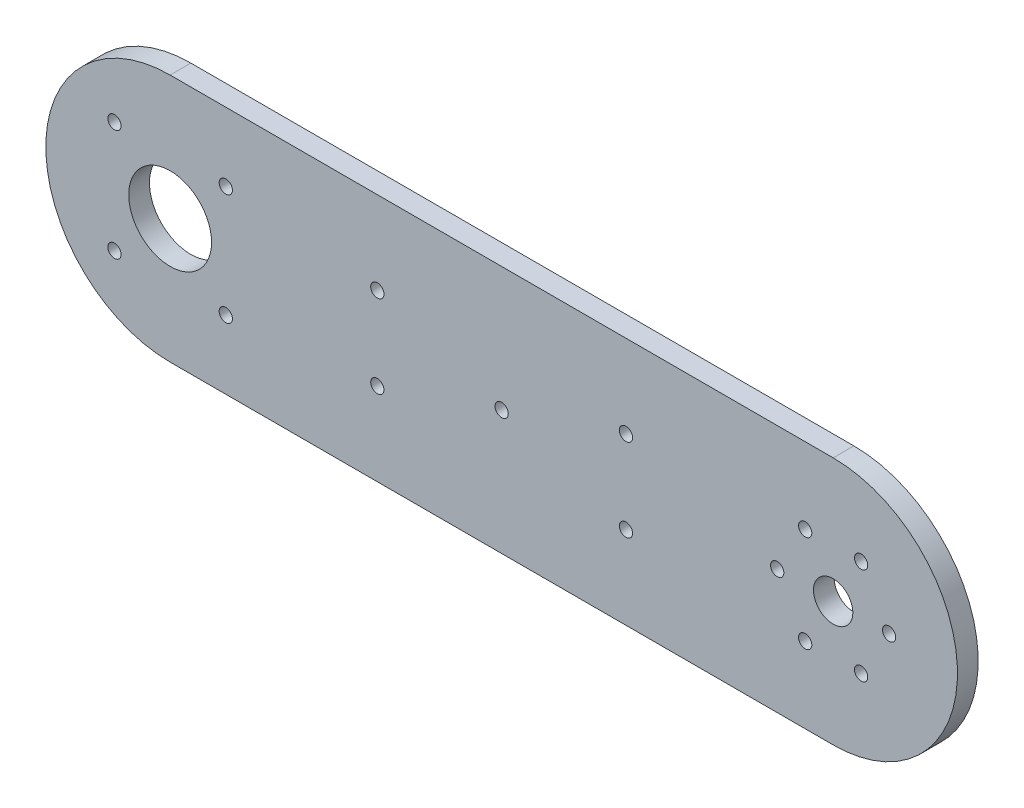
ISO-10303-21;
HEADER;
FILE_DESCRIPTION(('STEP AP214'),'2;1');
FILE_NAME('part.step','',(''),(''),'','','');
FILE_SCHEMA(('AUTOMOTIVE_DESIGN { 1 0 10303 214 1 1 1 1 }'));
ENDSEC;
DATA;
#1=APPLICATION_CONTEXT('core data for automotive mechanical design processes');
#2=APPLICATION_PROTOCOL_DEFINITION('international standard','automotive_design',2000,#1);
#3=PRODUCT_CONTEXT('',#1,'mechanical');
#4=PRODUCT('Part','Part','',(#3));
#5=PRODUCT_RELATED_PRODUCT_CATEGORY('part','',(#4));
#6=PRODUCT_DEFINITION_FORMATION('','',#4);
#7=PRODUCT_DEFINITION_CONTEXT('part definition',#1,'design');
#8=PRODUCT_DEFINITION('design','',#6,#7);
#9=PRODUCT_DEFINITION_SHAPE('','',#8);
#10=(LENGTH_UNIT() NAMED_UNIT(*) SI_UNIT(.MILLI.,.METRE.));
#11=(NAMED_UNIT(*) PLANE_ANGLE_UNIT() SI_UNIT($,.RADIAN.));
#12=(NAMED_UNIT(*) SI_UNIT($,.STERADIAN.) SOLID_ANGLE_UNIT());
#13=UNCERTAINTY_MEASURE_WITH_UNIT(LENGTH_MEASURE(1.E-05),#10,'distance_accuracy_value','');
#14=(GEOMETRIC_REPRESENTATION_CONTEXT(3) GLOBAL_UNCERTAINTY_ASSIGNED_CONTEXT((#13)) GLOBAL_UNIT_ASSIGNED_CONTEXT((#10,
#11,#12)) REPRESENTATION_CONTEXT('',''));
#15=CARTESIAN_POINT('',(0.,0.,0.));
#16=DIRECTION('',(0.,0.,1.));
#17=DIRECTION('',(1.,0.,0.));
#18=AXIS2_PLACEMENT_3D('',#15,#16,#17);
#19=CARTESIAN_POINT('',(80.,0.,5.));
#20=DIRECTION('',(0.,0.,1.));
#21=DIRECTION('',(1.,0.,0.));
#22=AXIS2_PLACEMENT_3D('',#19,#20,#21);
#23=PLANE('',#22);
#24=CARTESIAN_POINT('',(0.,0.,5.));
#25=DIRECTION('',(0.,0.,1.));
#26=DIRECTION('',(1.,0.,0.));
#27=AXIS2_PLACEMENT_3D('',#24,#25,#26);
#28=CIRCLE('',#27,1.60000000000001);
#29=CARTESIAN_POINT('',(1.60000000000001,0.,5.));
#30=VERTEX_POINT('',#29);
#31=EDGE_CURVE('E218',#30,#30,#28,.T.);
#32=ORIENTED_EDGE('',*,*,#31,.F.);
#33=EDGE_LOOP('',(#32));
#34=FACE_BOUND('',#33,.T.);
#35=CARTESIAN_POINT('',(-30.,-10.,5.));
#36=DIRECTION('',(0.,0.,1.));
#37=DIRECTION('',(1.,0.,0.));
#38=AXIS2_PLACEMENT_3D('',#35,#36,#37);
#39=CIRCLE('',#38,1.60000000000001);
#40=CARTESIAN_POINT('',(-28.4,-10.,5.));
#41=VERTEX_POINT('',#40);
#42=EDGE_CURVE('E212',#41,#41,#39,.T.);
#43=ORIENTED_EDGE('',*,*,#42,.F.);
#44=EDGE_LOOP('',(#43));
#45=FACE_BOUND('',#44,.T.);
#46=CARTESIAN_POINT('',(30.,10.,5.));
#47=DIRECTION('',(0.,0.,1.));
#48=DIRECTION('',(1.,0.,0.));
#49=AXIS2_PLACEMENT_3D('',#46,#47,#48);
#50=CIRCLE('',#49,1.60000000000001);
#51=CARTESIAN_POINT('',(31.6,10.,5.));
#52=VERTEX_POINT('',#51);
#53=EDGE_CURVE('E206',#52,#52,#50,.T.);
#54=ORIENTED_EDGE('',*,*,#53,.F.);
#55=EDGE_LOOP('',(#54));
#56=FACE_BOUND('',#55,.T.);
#57=CARTESIAN_POINT('',(30.,-9.99999999999999,5.));
#58=DIRECTION('',(0.,0.,1.));
#59=DIRECTION('',(1.,0.,0.));
#60=AXIS2_PLACEMENT_3D('',#57,#58,#59);
#61=CIRCLE('',#60,1.60000000000001);
#62=CARTESIAN_POINT('',(31.6,-9.99999999999999,5.));
#63=VERTEX_POINT('',#62);
#64=EDGE_CURVE('E200',#63,#63,#61,.T.);
#65=ORIENTED_EDGE('',*,*,#64,.F.);
#66=EDGE_LOOP('',(#65));
#67=FACE_BOUND('',#66,.T.);
#68=CARTESIAN_POINT('',(-30.,10.,5.));
#69=DIRECTION('',(0.,0.,1.));
#70=DIRECTION('',(1.,0.,0.));
#71=AXIS2_PLACEMENT_3D('',#68,#69,#70);
#72=CIRCLE('',#71,1.60000000000001);
#73=CARTESIAN_POINT('',(-28.4,10.,5.));
#74=VERTEX_POINT('',#73);
#75=EDGE_CURVE('E194',#74,#74,#72,.T.);
#76=ORIENTED_EDGE('',*,*,#75,.F.);
#77=EDGE_LOOP('',(#76));
#78=FACE_BOUND('',#77,.T.);
#79=CARTESIAN_POINT('',(-66.5649711574556,13.4350288425444,5.));
#80=DIRECTION('',(0.,0.,1.));
#81=DIRECTION('',(1.,0.,0.));
#82=AXIS2_PLACEMENT_3D('',#79,#80,#81);
#83=CIRCLE('',#82,1.60000000000002);
#84=CARTESIAN_POINT('',(-64.9649711574556,13.4350288425444,5.));
#85=VERTEX_POINT('',#84);
#86=EDGE_CURVE('E188',#85,#85,#83,.T.);
#87=ORIENTED_EDGE('',*,*,#86,.F.);
#88=EDGE_LOOP('',(#87));
#89=FACE_BOUND('',#88,.T.);
#90=CARTESIAN_POINT('',(-93.4350288425444,13.4350288425444,5.));
#91=DIRECTION('',(0.,0.,1.));
#92=DIRECTION('',(1.,0.,0.));
#93=AXIS2_PLACEMENT_3D('',#90,#91,#92);
#94=CIRCLE('',#93,1.60000000000002);
#95=CARTESIAN_POINT('',(-91.8350288425444,13.4350288425444,5.));
#96=VERTEX_POINT('',#95);
#97=EDGE_CURVE('E182',#96,#96,#94,.T.);
#98=ORIENTED_EDGE('',*,*,#97,.F.);
#99=EDGE_LOOP('',(#98));
#100=FACE_BOUND('',#99,.T.);
#101=CARTESIAN_POINT('',(-93.4350288425444,-13.4350288425444,5.));
#102=DIRECTION('',(0.,0.,1.));
#103=DIRECTION('',(1.,0.,0.));
#104=AXIS2_PLACEMENT_3D('',#101,#102,#103);
#105=CIRCLE('',#104,1.60000000000002);
#106=CARTESIAN_POINT('',(-91.8350288425444,-13.4350288425444,5.));
#107=VERTEX_POINT('',#106);
#108=EDGE_CURVE('E176',#107,#107,#105,.T.);
#109=ORIENTED_EDGE('',*,*,#108,.F.);
#110=EDGE_LOOP('',(#109));
#111=FACE_BOUND('',#110,.T.);
#112=CARTESIAN_POINT('',(-66.5649711574556,-13.4350288425444,5.));
#113=DIRECTION('',(0.,0.,1.));
#114=DIRECTION('',(1.,0.,0.));
#115=AXIS2_PLACEMENT_3D('',#112,#113,#114);
#116=CIRCLE('',#115,1.60000000000002);
#117=CARTESIAN_POINT('',(-64.9649711574556,-13.4350288425444,5.));
#118=VERTEX_POINT('',#117);
#119=EDGE_CURVE('E170',#118,#118,#116,.T.);
#120=ORIENTED_EDGE('',*,*,#119,.F.);
#121=EDGE_LOOP('',(#120));
#122=FACE_BOUND('',#121,.T.);
#123=CARTESIAN_POINT('',(86.75,-11.6913429510899,5.));
#124=DIRECTION('',(0.,0.,1.));
#125=DIRECTION('',(1.,0.,0.));
#126=AXIS2_PLACEMENT_3D('',#123,#124,#125);
#127=CIRCLE('',#126,1.60000000000002);
#128=CARTESIAN_POINT('',(88.35,-11.6913429510899,5.));
#129=VERTEX_POINT('',#128);
#130=EDGE_CURVE('E164',#129,#129,#127,.T.);
#131=ORIENTED_EDGE('',*,*,#130,.F.);
#132=EDGE_LOOP('',(#131));
#133=FACE_BOUND('',#132,.T.);
#134=CARTESIAN_POINT('',(93.5,0.,5.));
#135=DIRECTION('',(0.,0.,1.));
#136=DIRECTION('',(1.,0.,0.));
#137=AXIS2_PLACEMENT_3D('',#134,#135,#136);
#138=CIRCLE('',#137,1.60000000000002);
#139=CARTESIAN_POINT('',(95.1,0.,5.));
#140=VERTEX_POINT('',#139);
#141=EDGE_CURVE('E158',#140,#140,#138,.T.);
#142=ORIENTED_EDGE('',*,*,#141,.F.);
#143=EDGE_LOOP('',(#142));
#144=FACE_BOUND('',#143,.T.);
#145=CARTESIAN_POINT('',(86.75,11.6913429510899,5.));
#146=DIRECTION('',(0.,0.,1.));
#147=DIRECTION('',(1.,0.,0.));
#148=AXIS2_PLACEMENT_3D('',#145,#146,#147);
#149=CIRCLE('',#148,1.60000000000002);
#150=CARTESIAN_POINT('',(88.35,11.6913429510899,5.));
#151=VERTEX_POINT('',#150);
#152=EDGE_CURVE('E152',#151,#151,#149,.T.);
#153=ORIENTED_EDGE('',*,*,#152,.F.);
#154=EDGE_LOOP('',(#153));
#155=FACE_BOUND('',#154,.T.);
#156=CARTESIAN_POINT('',(73.25,11.6913429510899,5.));
#157=DIRECTION('',(0.,0.,1.));
#158=DIRECTION('',(1.,0.,0.));
#159=AXIS2_PLACEMENT_3D('',#156,#157,#158);
#160=CIRCLE('',#159,1.60000000000002);
#161=CARTESIAN_POINT('',(74.85,11.6913429510899,5.));
#162=VERTEX_POINT('',#161);
#163=EDGE_CURVE('E146',#162,#162,#160,.T.);
#164=ORIENTED_EDGE('',*,*,#163,.F.);
#165=EDGE_LOOP('',(#164));
#166=FACE_BOUND('',#165,.T.);
#167=CARTESIAN_POINT('',(66.5,0.,5.));
#168=DIRECTION('',(0.,0.,1.));
#169=DIRECTION('',(1.,0.,0.));
#170=AXIS2_PLACEMENT_3D('',#167,#168,#169);
#171=CIRCLE('',#170,1.60000000000002);
#172=CARTESIAN_POINT('',(68.1,0.,5.));
#173=VERTEX_POINT('',#172);
#174=EDGE_CURVE('E140',#173,#173,#171,.T.);
#175=ORIENTED_EDGE('',*,*,#174,.F.);
#176=EDGE_LOOP('',(#175));
#177=FACE_BOUND('',#176,.T.);
#178=CARTESIAN_POINT('',(73.25,-11.6913429510899,5.));
#179=DIRECTION('',(0.,0.,1.));
#180=DIRECTION('',(1.,0.,0.));
#181=AXIS2_PLACEMENT_3D('',#178,#179,#180);
#182=CIRCLE('',#181,1.60000000000002);
#183=CARTESIAN_POINT('',(74.85,-11.6913429510899,5.));
#184=VERTEX_POINT('',#183);
#185=EDGE_CURVE('E134',#184,#184,#182,.T.);
#186=ORIENTED_EDGE('',*,*,#185,.F.);
#187=EDGE_LOOP('',(#186));
#188=FACE_BOUND('',#187,.T.);
#189=CARTESIAN_POINT('',(-80.,0.,5.));
#190=DIRECTION('',(0.,0.,1.));
#191=DIRECTION('',(1.,0.,0.));
#192=AXIS2_PLACEMENT_3D('',#189,#190,#191);
#193=CIRCLE('',#192,9.99999999999999);
#194=CARTESIAN_POINT('',(-70.,0.,5.));
#195=VERTEX_POINT('',#194);
#196=EDGE_CURVE('E108',#195,#195,#193,.T.);
#197=ORIENTED_EDGE('',*,*,#196,.F.);
#198=EDGE_LOOP('',(#197));
#199=FACE_BOUND('',#198,.T.);
#200=CARTESIAN_POINT('',(80.,0.,5.));
#201=DIRECTION('',(0.,0.,1.));
#202=DIRECTION('',(1.,0.,0.));
#203=AXIS2_PLACEMENT_3D('',#200,#201,#202);
#204=CIRCLE('',#203,30.);
#205=CARTESIAN_POINT('',(80.,-29.9999999999999,5.));
#206=VERTEX_POINT('',#205);
#207=CARTESIAN_POINT('',(80.,30.0000000000001,5.));
#208=VERTEX_POINT('',#207);
#209=EDGE_CURVE('E93',#206,#208,#204,.T.);
#210=ORIENTED_EDGE('',*,*,#209,.T.);
#211=DIRECTION('',(-1.,0.,0.));
#212=VECTOR('',#211,1.);
#213=CARTESIAN_POINT('',(80.,30.0000000000001,5.));
#214=LINE('',#213,#212);
#215=CARTESIAN_POINT('',(-80.,30.,5.));
#216=VERTEX_POINT('',#215);
#217=EDGE_CURVE('E88',#208,#216,#214,.T.);
#218=ORIENTED_EDGE('',*,*,#217,.T.);
#219=CARTESIAN_POINT('',(-80.,0.,5.));
#220=DIRECTION('',(0.,0.,1.));
#221=DIRECTION('',(1.,0.,0.));
#222=AXIS2_PLACEMENT_3D('',#219,#220,#221);
#223=CIRCLE('',#222,30.);
#224=CARTESIAN_POINT('',(-80.,-30.,5.));
#225=VERTEX_POINT('',#224);
#226=EDGE_CURVE('E91',#216,#225,#223,.T.);
#227=ORIENTED_EDGE('',*,*,#226,.T.);
#228=DIRECTION('',(1.,0.,0.));
#229=VECTOR('',#228,1.);
#230=CARTESIAN_POINT('',(80.,-29.9999999999999,5.));
#231=LINE('',#230,#229);
#232=EDGE_CURVE('E58',#225,#206,#231,.T.);
#233=ORIENTED_EDGE('',*,*,#232,.T.);
#234=EDGE_LOOP('',(#210,#218,#227,#233));
#235=FACE_BOUND('',#234,.T.);
#236=CARTESIAN_POINT('',(80.,0.,5.));
#237=DIRECTION('',(0.,0.,1.));
#238=DIRECTION('',(1.,0.,0.));
#239=AXIS2_PLACEMENT_3D('',#236,#237,#238);
#240=CIRCLE('',#239,4.75);
#241=CARTESIAN_POINT('',(84.75,0.,5.));
#242=VERTEX_POINT('',#241);
#243=EDGE_CURVE('E123',#242,#242,#240,.T.);
#244=ORIENTED_EDGE('',*,*,#243,.F.);
#245=EDGE_LOOP('',(#244));
#246=FACE_BOUND('',#245,.T.);
#247=ADVANCED_FACE('F41',(#34,#45,#56,#67,#78,#89,#100,#111,#122,#133,#144,#155,#166,#177,#188,
#199,#235,#246),#23,.T.);
#248=CARTESIAN_POINT('',(80.,0.,0.));
#249=DIRECTION('',(0.,0.,1.));
#250=DIRECTION('',(1.,0.,0.));
#251=AXIS2_PLACEMENT_3D('',#248,#249,#250);
#252=PLANE('',#251);
#253=CARTESIAN_POINT('',(0.,0.,0.));
#254=DIRECTION('',(0.,0.,1.));
#255=DIRECTION('',(1.,0.,0.));
#256=AXIS2_PLACEMENT_3D('',#253,#254,#255);
#257=CIRCLE('',#256,1.60000000000001);
#258=CARTESIAN_POINT('',(1.60000000000001,0.,0.));
#259=VERTEX_POINT('',#258);
#260=EDGE_CURVE('E215',#259,#259,#257,.T.);
#261=ORIENTED_EDGE('',*,*,#260,.T.);
#262=EDGE_LOOP('',(#261));
#263=FACE_BOUND('',#262,.T.);
#264=CARTESIAN_POINT('',(-30.,-10.,0.));
#265=DIRECTION('',(0.,0.,1.));
#266=DIRECTION('',(1.,0.,0.));
#267=AXIS2_PLACEMENT_3D('',#264,#265,#266);
#268=CIRCLE('',#267,1.60000000000001);
#269=CARTESIAN_POINT('',(-28.4,-10.,0.));
#270=VERTEX_POINT('',#269);
#271=EDGE_CURVE('E209',#270,#270,#268,.T.);
#272=ORIENTED_EDGE('',*,*,#271,.T.);
#273=EDGE_LOOP('',(#272));
#274=FACE_BOUND('',#273,.T.);
#275=CARTESIAN_POINT('',(30.,10.,0.));
#276=DIRECTION('',(0.,0.,1.));
#277=DIRECTION('',(1.,0.,0.));
#278=AXIS2_PLACEMENT_3D('',#275,#276,#277);
#279=CIRCLE('',#278,1.60000000000001);
#280=CARTESIAN_POINT('',(31.6,10.,0.));
#281=VERTEX_POINT('',#280);
#282=EDGE_CURVE('E203',#281,#281,#279,.T.);
#283=ORIENTED_EDGE('',*,*,#282,.T.);
#284=EDGE_LOOP('',(#283));
#285=FACE_BOUND('',#284,.T.);
#286=CARTESIAN_POINT('',(30.,-9.99999999999999,0.));
#287=DIRECTION('',(0.,0.,1.));
#288=DIRECTION('',(1.,0.,0.));
#289=AXIS2_PLACEMENT_3D('',#286,#287,#288);
#290=CIRCLE('',#289,1.60000000000001);
#291=CARTESIAN_POINT('',(31.6,-9.99999999999999,0.));
#292=VERTEX_POINT('',#291);
#293=EDGE_CURVE('E197',#292,#292,#290,.T.);
#294=ORIENTED_EDGE('',*,*,#293,.T.);
#295=EDGE_LOOP('',(#294));
#296=FACE_BOUND('',#295,.T.);
#297=CARTESIAN_POINT('',(-30.,10.,0.));
#298=DIRECTION('',(0.,0.,1.));
#299=DIRECTION('',(1.,0.,0.));
#300=AXIS2_PLACEMENT_3D('',#297,#298,#299);
#301=CIRCLE('',#300,1.60000000000001);
#302=CARTESIAN_POINT('',(-28.4,10.,0.));
#303=VERTEX_POINT('',#302);
#304=EDGE_CURVE('E191',#303,#303,#301,.T.);
#305=ORIENTED_EDGE('',*,*,#304,.T.);
#306=EDGE_LOOP('',(#305));
#307=FACE_BOUND('',#306,.T.);
#308=CARTESIAN_POINT('',(-66.5649711574556,13.4350288425444,0.));
#309=DIRECTION('',(0.,0.,1.));
#310=DIRECTION('',(1.,0.,0.));
#311=AXIS2_PLACEMENT_3D('',#308,#309,#310);
#312=CIRCLE('',#311,1.60000000000002);
#313=CARTESIAN_POINT('',(-64.9649711574556,13.4350288425444,0.));
#314=VERTEX_POINT('',#313);
#315=EDGE_CURVE('E185',#314,#314,#312,.T.);
#316=ORIENTED_EDGE('',*,*,#315,.T.);
#317=EDGE_LOOP('',(#316));
#318=FACE_BOUND('',#317,.T.);
#319=CARTESIAN_POINT('',(-93.4350288425444,13.4350288425444,0.));
#320=DIRECTION('',(0.,0.,1.));
#321=DIRECTION('',(1.,0.,0.));
#322=AXIS2_PLACEMENT_3D('',#319,#320,#321);
#323=CIRCLE('',#322,1.60000000000002);
#324=CARTESIAN_POINT('',(-91.8350288425444,13.4350288425444,0.));
#325=VERTEX_POINT('',#324);
#326=EDGE_CURVE('E179',#325,#325,#323,.T.);
#327=ORIENTED_EDGE('',*,*,#326,.T.);
#328=EDGE_LOOP('',(#327));
#329=FACE_BOUND('',#328,.T.);
#330=CARTESIAN_POINT('',(-93.4350288425444,-13.4350288425444,0.));
#331=DIRECTION('',(0.,0.,1.));
#332=DIRECTION('',(1.,0.,0.));
#333=AXIS2_PLACEMENT_3D('',#330,#331,#332);
#334=CIRCLE('',#333,1.60000000000002);
#335=CARTESIAN_POINT('',(-91.8350288425444,-13.4350288425444,0.));
#336=VERTEX_POINT('',#335);
#337=EDGE_CURVE('E173',#336,#336,#334,.T.);
#338=ORIENTED_EDGE('',*,*,#337,.T.);
#339=EDGE_LOOP('',(#338));
#340=FACE_BOUND('',#339,.T.);
#341=CARTESIAN_POINT('',(-66.5649711574556,-13.4350288425444,0.));
#342=DIRECTION('',(0.,0.,1.));
#343=DIRECTION('',(1.,0.,0.));
#344=AXIS2_PLACEMENT_3D('',#341,#342,#343);
#345=CIRCLE('',#344,1.60000000000002);
#346=CARTESIAN_POINT('',(-64.9649711574556,-13.4350288425444,0.));
#347=VERTEX_POINT('',#346);
#348=EDGE_CURVE('E167',#347,#347,#345,.T.);
#349=ORIENTED_EDGE('',*,*,#348,.T.);
#350=EDGE_LOOP('',(#349));
#351=FACE_BOUND('',#350,.T.);
#352=CARTESIAN_POINT('',(86.75,-11.6913429510899,0.));
#353=DIRECTION('',(0.,0.,1.));
#354=DIRECTION('',(1.,0.,0.));
#355=AXIS2_PLACEMENT_3D('',#352,#353,#354);
#356=CIRCLE('',#355,1.60000000000002);
#357=CARTESIAN_POINT('',(88.35,-11.6913429510899,0.));
#358=VERTEX_POINT('',#357);
#359=EDGE_CURVE('E161',#358,#358,#356,.T.);
#360=ORIENTED_EDGE('',*,*,#359,.T.);
#361=EDGE_LOOP('',(#360));
#362=FACE_BOUND('',#361,.T.);
#363=CARTESIAN_POINT('',(93.5,0.,0.));
#364=DIRECTION('',(0.,0.,1.));
#365=DIRECTION('',(1.,0.,0.));
#366=AXIS2_PLACEMENT_3D('',#363,#364,#365);
#367=CIRCLE('',#366,1.60000000000002);
#368=CARTESIAN_POINT('',(95.1,0.,0.));
#369=VERTEX_POINT('',#368);
#370=EDGE_CURVE('E155',#369,#369,#367,.T.);
#371=ORIENTED_EDGE('',*,*,#370,.T.);
#372=EDGE_LOOP('',(#371));
#373=FACE_BOUND('',#372,.T.);
#374=CARTESIAN_POINT('',(86.75,11.6913429510899,0.));
#375=DIRECTION('',(0.,0.,1.));
#376=DIRECTION('',(1.,0.,0.));
#377=AXIS2_PLACEMENT_3D('',#374,#375,#376);
#378=CIRCLE('',#377,1.60000000000002);
#379=CARTESIAN_POINT('',(88.35,11.6913429510899,0.));
#380=VERTEX_POINT('',#379);
#381=EDGE_CURVE('E149',#380,#380,#378,.T.);
#382=ORIENTED_EDGE('',*,*,#381,.T.);
#383=EDGE_LOOP('',(#382));
#384=FACE_BOUND('',#383,.T.);
#385=CARTESIAN_POINT('',(73.25,11.6913429510899,0.));
#386=DIRECTION('',(0.,0.,1.));
#387=DIRECTION('',(1.,0.,0.));
#388=AXIS2_PLACEMENT_3D('',#385,#386,#387);
#389=CIRCLE('',#388,1.60000000000002);
#390=CARTESIAN_POINT('',(74.85,11.6913429510899,0.));
#391=VERTEX_POINT('',#390);
#392=EDGE_CURVE('E143',#391,#391,#389,.T.);
#393=ORIENTED_EDGE('',*,*,#392,.T.);
#394=EDGE_LOOP('',(#393));
#395=FACE_BOUND('',#394,.T.);
#396=CARTESIAN_POINT('',(66.5,0.,0.));
#397=DIRECTION('',(0.,0.,1.));
#398=DIRECTION('',(1.,0.,0.));
#399=AXIS2_PLACEMENT_3D('',#396,#397,#398);
#400=CIRCLE('',#399,1.60000000000002);
#401=CARTESIAN_POINT('',(68.1,0.,0.));
#402=VERTEX_POINT('',#401);
#403=EDGE_CURVE('E137',#402,#402,#400,.T.);
#404=ORIENTED_EDGE('',*,*,#403,.T.);
#405=EDGE_LOOP('',(#404));
#406=FACE_BOUND('',#405,.T.);
#407=CARTESIAN_POINT('',(73.25,-11.6913429510899,0.));
#408=DIRECTION('',(0.,0.,1.));
#409=DIRECTION('',(1.,0.,0.));
#410=AXIS2_PLACEMENT_3D('',#407,#408,#409);
#411=CIRCLE('',#410,1.60000000000002);
#412=CARTESIAN_POINT('',(74.85,-11.6913429510899,0.));
#413=VERTEX_POINT('',#412);
#414=EDGE_CURVE('E129',#413,#413,#411,.T.);
#415=ORIENTED_EDGE('',*,*,#414,.T.);
#416=EDGE_LOOP('',(#415));
#417=FACE_BOUND('',#416,.T.);
#418=CARTESIAN_POINT('',(80.,0.,0.));
#419=DIRECTION('',(0.,0.,1.));
#420=DIRECTION('',(1.,0.,0.));
#421=AXIS2_PLACEMENT_3D('',#418,#419,#420);
#422=CIRCLE('',#421,30.);
#423=CARTESIAN_POINT('',(80.,-29.9999999999999,0.));
#424=VERTEX_POINT('',#423);
#425=CARTESIAN_POINT('',(80.,30.0000000000001,0.));
#426=VERTEX_POINT('',#425);
#427=EDGE_CURVE('E105',#424,#426,#422,.T.);
#428=ORIENTED_EDGE('',*,*,#427,.F.);
#429=DIRECTION('',(1.,0.,0.));
#430=VECTOR('',#429,1.);
#431=CARTESIAN_POINT('',(80.,-29.9999999999999,0.));
#432=LINE('',#431,#430);
#433=CARTESIAN_POINT('',(-80.,-30.,0.));
#434=VERTEX_POINT('',#433);
#435=EDGE_CURVE('E81',#434,#424,#432,.T.);
#436=ORIENTED_EDGE('',*,*,#435,.F.);
#437=CARTESIAN_POINT('',(-80.,0.,0.));
#438=DIRECTION('',(0.,0.,1.));
#439=DIRECTION('',(1.,0.,0.));
#440=AXIS2_PLACEMENT_3D('',#437,#438,#439);
#441=CIRCLE('',#440,30.);
#442=CARTESIAN_POINT('',(-80.,30.,0.));
#443=VERTEX_POINT('',#442);
#444=EDGE_CURVE('E75',#443,#434,#441,.T.);
#445=ORIENTED_EDGE('',*,*,#444,.F.);
#446=DIRECTION('',(-1.,0.,0.));
#447=VECTOR('',#446,1.);
#448=CARTESIAN_POINT('',(80.,30.0000000000001,0.));
#449=LINE('',#448,#447);
#450=EDGE_CURVE('E97',#426,#443,#449,.T.);
#451=ORIENTED_EDGE('',*,*,#450,.F.);
#452=EDGE_LOOP('',(#428,#436,#445,#451));
#453=FACE_BOUND('',#452,.T.);
#454=CARTESIAN_POINT('',(-80.,0.,0.));
#455=DIRECTION('',(0.,0.,1.));
#456=DIRECTION('',(1.,0.,0.));
#457=AXIS2_PLACEMENT_3D('',#454,#455,#456);
#458=CIRCLE('',#457,9.99999999999999);
#459=CARTESIAN_POINT('',(-70.,0.,0.));
#460=VERTEX_POINT('',#459);
#461=EDGE_CURVE('E120',#460,#460,#458,.T.);
#462=ORIENTED_EDGE('',*,*,#461,.T.);
#463=EDGE_LOOP('',(#462));
#464=FACE_BOUND('',#463,.T.);
#465=CARTESIAN_POINT('',(80.,0.,0.));
#466=DIRECTION('',(0.,0.,1.));
#467=DIRECTION('',(1.,0.,0.));
#468=AXIS2_PLACEMENT_3D('',#465,#466,#467);
#469=CIRCLE('',#468,4.75);
#470=CARTESIAN_POINT('',(84.75,0.,0.));
#471=VERTEX_POINT('',#470);
#472=EDGE_CURVE('E126',#471,#471,#469,.T.);
#473=ORIENTED_EDGE('',*,*,#472,.T.);
#474=EDGE_LOOP('',(#473));
#475=FACE_BOUND('',#474,.T.);
#476=ADVANCED_FACE('F116',(#263,#274,#285,#296,#307,#318,#329,#340,#351,#362,#373,#384,#395,
#406,#417,#453,#464,#475),#252,.F.);
#477=CARTESIAN_POINT('',(80.,0.,5.));
#478=DIRECTION('',(0.,0.,-1.));
#479=DIRECTION('',(-1.,0.,0.));
#480=AXIS2_PLACEMENT_3D('',#477,#478,#479);
#481=CYLINDRICAL_SURFACE('',#480,30.);
#482=ORIENTED_EDGE('',*,*,#427,.T.);
#483=DIRECTION('',(0.,0.,-1.));
#484=VECTOR('',#483,1.);
#485=CARTESIAN_POINT('',(80.,30.0000000000001,5.));
#486=LINE('',#485,#484);
#487=EDGE_CURVE('E11',#208,#426,#486,.T.);
#488=ORIENTED_EDGE('',*,*,#487,.F.);
#489=ORIENTED_EDGE('',*,*,#209,.F.);
#490=DIRECTION('',(0.,0.,-1.));
#491=VECTOR('',#490,1.);
#492=CARTESIAN_POINT('',(80.,-29.9999999999999,5.));
#493=LINE('',#492,#491);
#494=EDGE_CURVE('E101',#206,#424,#493,.T.);
#495=ORIENTED_EDGE('',*,*,#494,.T.);
#496=EDGE_LOOP('',(#482,#488,#489,#495));
#497=FACE_BOUND('',#496,.T.);
#498=ADVANCED_FACE('F43',(#497),#481,.T.);
#499=CARTESIAN_POINT('',(80.,30.0000000000001,5.));
#500=DIRECTION('',(0.,-1.,0.));
#501=DIRECTION('',(1.,0.,0.));
#502=AXIS2_PLACEMENT_3D('',#499,#500,#501);
#503=PLANE('',#502);
#504=ORIENTED_EDGE('',*,*,#450,.T.);
#505=DIRECTION('',(0.,0.,-1.));
#506=VECTOR('',#505,1.);
#507=CARTESIAN_POINT('',(-80.,30.,5.));
#508=LINE('',#507,#506);
#509=EDGE_CURVE('E50',#216,#443,#508,.T.);
#510=ORIENTED_EDGE('',*,*,#509,.F.);
#511=ORIENTED_EDGE('',*,*,#217,.F.);
#512=ORIENTED_EDGE('',*,*,#487,.T.);
#513=EDGE_LOOP('',(#504,#510,#511,#512));
#514=FACE_BOUND('',#513,.T.);
#515=ADVANCED_FACE('F96',(#514),#503,.F.);
#516=CARTESIAN_POINT('',(-80.,0.,5.));
#517=DIRECTION('',(0.,0.,-1.));
#518=DIRECTION('',(-1.,0.,0.));
#519=AXIS2_PLACEMENT_3D('',#516,#517,#518);
#520=CYLINDRICAL_SURFACE('',#519,30.);
#521=ORIENTED_EDGE('',*,*,#444,.T.);
#522=DIRECTION('',(0.,0.,-1.));
#523=VECTOR('',#522,1.);
#524=CARTESIAN_POINT('',(-80.,-30.,5.));
#525=LINE('',#524,#523);
#526=EDGE_CURVE('E98',#225,#434,#525,.T.);
#527=ORIENTED_EDGE('',*,*,#526,.F.);
#528=ORIENTED_EDGE('',*,*,#226,.F.);
#529=ORIENTED_EDGE('',*,*,#509,.T.);
#530=EDGE_LOOP('',(#521,#527,#528,#529));
#531=FACE_BOUND('',#530,.T.);
#532=ADVANCED_FACE('F99',(#531),#520,.T.);
#533=CARTESIAN_POINT('',(80.,-29.9999999999999,5.));
#534=DIRECTION('',(0.,1.,0.));
#535=DIRECTION('',(-1.,0.,0.));
#536=AXIS2_PLACEMENT_3D('',#533,#534,#535);
#537=PLANE('',#536);
#538=ORIENTED_EDGE('',*,*,#435,.T.);
#539=ORIENTED_EDGE('',*,*,#494,.F.);
#540=ORIENTED_EDGE('',*,*,#232,.F.);
#541=ORIENTED_EDGE('',*,*,#526,.T.);
#542=EDGE_LOOP('',(#538,#539,#540,#541));
#543=FACE_BOUND('',#542,.T.);
#544=ADVANCED_FACE('F113',(#543),#537,.F.);
#545=CARTESIAN_POINT('',(-80.,0.,5.));
#546=DIRECTION('',(0.,0.,-1.));
#547=DIRECTION('',(-1.,0.,0.));
#548=AXIS2_PLACEMENT_3D('',#545,#546,#547);
#549=CYLINDRICAL_SURFACE('',#548,9.99999999999999);
#550=ORIENTED_EDGE('',*,*,#196,.T.);
#551=EDGE_LOOP('',(#550));
#552=FACE_BOUND('',#551,.T.);
#553=ORIENTED_EDGE('',*,*,#461,.F.);
#554=EDGE_LOOP('',(#553));
#555=FACE_BOUND('',#554,.T.);
#556=ADVANCED_FACE('F257',(#552,#555),#549,.F.);
#557=CARTESIAN_POINT('',(80.,0.,5.));
#558=DIRECTION('',(0.,0.,-1.));
#559=DIRECTION('',(-1.,0.,0.));
#560=AXIS2_PLACEMENT_3D('',#557,#558,#559);
#561=CYLINDRICAL_SURFACE('',#560,4.75);
#562=ORIENTED_EDGE('',*,*,#243,.T.);
#563=EDGE_LOOP('',(#562));
#564=FACE_BOUND('',#563,.T.);
#565=ORIENTED_EDGE('',*,*,#472,.F.);
#566=EDGE_LOOP('',(#565));
#567=FACE_BOUND('',#566,.T.);
#568=ADVANCED_FACE('F260',(#564,#567),#561,.F.);
#569=CARTESIAN_POINT('',(73.25,-11.6913429510899,5.));
#570=DIRECTION('',(0.,0.,1.));
#571=DIRECTION('',(1.,0.,0.));
#572=AXIS2_PLACEMENT_3D('',#569,#570,#571);
#573=CYLINDRICAL_SURFACE('',#572,1.60000000000002);
#574=ORIENTED_EDGE('',*,*,#414,.F.);
#575=EDGE_LOOP('',(#574));
#576=FACE_BOUND('',#575,.T.);
#577=ORIENTED_EDGE('',*,*,#185,.T.);
#578=EDGE_LOOP('',(#577));
#579=FACE_BOUND('',#578,.T.);
#580=ADVANCED_FACE('F270',(#576,#579),#573,.F.);
#581=CARTESIAN_POINT('',(66.5,0.,5.));
#582=DIRECTION('',(0.,0.,1.));
#583=DIRECTION('',(1.,0.,0.));
#584=AXIS2_PLACEMENT_3D('',#581,#582,#583);
#585=CYLINDRICAL_SURFACE('',#584,1.60000000000002);
#586=ORIENTED_EDGE('',*,*,#403,.F.);
#587=EDGE_LOOP('',(#586));
#588=FACE_BOUND('',#587,.T.);
#589=ORIENTED_EDGE('',*,*,#174,.T.);
#590=EDGE_LOOP('',(#589));
#591=FACE_BOUND('',#590,.T.);
#592=ADVANCED_FACE('F276',(#588,#591),#585,.F.);
#593=CARTESIAN_POINT('',(73.25,11.6913429510899,5.));
#594=DIRECTION('',(0.,0.,1.));
#595=DIRECTION('',(1.,0.,0.));
#596=AXIS2_PLACEMENT_3D('',#593,#594,#595);
#597=CYLINDRICAL_SURFACE('',#596,1.60000000000002);
#598=ORIENTED_EDGE('',*,*,#392,.F.);
#599=EDGE_LOOP('',(#598));
#600=FACE_BOUND('',#599,.T.);
#601=ORIENTED_EDGE('',*,*,#163,.T.);
#602=EDGE_LOOP('',(#601));
#603=FACE_BOUND('',#602,.T.);
#604=ADVANCED_FACE('F337',(#600,#603),#597,.F.);
#605=CARTESIAN_POINT('',(86.75,11.6913429510899,5.));
#606=DIRECTION('',(0.,0.,1.));
#607=DIRECTION('',(1.,0.,0.));
#608=AXIS2_PLACEMENT_3D('',#605,#606,#607);
#609=CYLINDRICAL_SURFACE('',#608,1.60000000000002);
#610=ORIENTED_EDGE('',*,*,#381,.F.);
#611=EDGE_LOOP('',(#610));
#612=FACE_BOUND('',#611,.T.);
#613=ORIENTED_EDGE('',*,*,#152,.T.);
#614=EDGE_LOOP('',(#613));
#615=FACE_BOUND('',#614,.T.);
#616=ADVANCED_FACE('F346',(#612,#615),#609,.F.);
#617=CARTESIAN_POINT('',(93.5,0.,5.));
#618=DIRECTION('',(0.,0.,1.));
#619=DIRECTION('',(1.,0.,0.));
#620=AXIS2_PLACEMENT_3D('',#617,#618,#619);
#621=CYLINDRICAL_SURFACE('',#620,1.60000000000002);
#622=ORIENTED_EDGE('',*,*,#370,.F.);
#623=EDGE_LOOP('',(#622));
#624=FACE_BOUND('',#623,.T.);
#625=ORIENTED_EDGE('',*,*,#141,.T.);
#626=EDGE_LOOP('',(#625));
#627=FACE_BOUND('',#626,.T.);
#628=ADVANCED_FACE('F356',(#624,#627),#621,.F.);
#629=CARTESIAN_POINT('',(86.75,-11.6913429510899,5.));
#630=DIRECTION('',(0.,0.,1.));
#631=DIRECTION('',(1.,0.,0.));
#632=AXIS2_PLACEMENT_3D('',#629,#630,#631);
#633=CYLINDRICAL_SURFACE('',#632,1.60000000000002);
#634=ORIENTED_EDGE('',*,*,#359,.F.);
#635=EDGE_LOOP('',(#634));
#636=FACE_BOUND('',#635,.T.);
#637=ORIENTED_EDGE('',*,*,#130,.T.);
#638=EDGE_LOOP('',(#637));
#639=FACE_BOUND('',#638,.T.);
#640=ADVANCED_FACE('F366',(#636,#639),#633,.F.);
#641=CARTESIAN_POINT('',(-66.5649711574556,-13.4350288425444,5.));
#642=DIRECTION('',(0.,0.,1.));
#643=DIRECTION('',(1.,0.,0.));
#644=AXIS2_PLACEMENT_3D('',#641,#642,#643);
#645=CYLINDRICAL_SURFACE('',#644,1.60000000000002);
#646=ORIENTED_EDGE('',*,*,#348,.F.);
#647=EDGE_LOOP('',(#646));
#648=FACE_BOUND('',#647,.T.);
#649=ORIENTED_EDGE('',*,*,#119,.T.);
#650=EDGE_LOOP('',(#649));
#651=FACE_BOUND('',#650,.T.);
#652=ADVANCED_FACE('F376',(#648,#651),#645,.F.);
#653=CARTESIAN_POINT('',(-93.4350288425444,-13.4350288425444,5.));
#654=DIRECTION('',(0.,0.,1.));
#655=DIRECTION('',(1.,0.,0.));
#656=AXIS2_PLACEMENT_3D('',#653,#654,#655);
#657=CYLINDRICAL_SURFACE('',#656,1.60000000000002);
#658=ORIENTED_EDGE('',*,*,#337,.F.);
#659=EDGE_LOOP('',(#658));
#660=FACE_BOUND('',#659,.T.);
#661=ORIENTED_EDGE('',*,*,#108,.T.);
#662=EDGE_LOOP('',(#661));
#663=FACE_BOUND('',#662,.T.);
#664=ADVANCED_FACE('F386',(#660,#663),#657,.F.);
#665=CARTESIAN_POINT('',(-93.4350288425444,13.4350288425444,5.));
#666=DIRECTION('',(0.,0.,1.));
#667=DIRECTION('',(1.,0.,0.));
#668=AXIS2_PLACEMENT_3D('',#665,#666,#667);
#669=CYLINDRICAL_SURFACE('',#668,1.60000000000002);
#670=ORIENTED_EDGE('',*,*,#326,.F.);
#671=EDGE_LOOP('',(#670));
#672=FACE_BOUND('',#671,.T.);
#673=ORIENTED_EDGE('',*,*,#97,.T.);
#674=EDGE_LOOP('',(#673));
#675=FACE_BOUND('',#674,.T.);
#676=ADVANCED_FACE('F396',(#672,#675),#669,.F.);
#677=CARTESIAN_POINT('',(-66.5649711574556,13.4350288425444,5.));
#678=DIRECTION('',(0.,0.,1.));
#679=DIRECTION('',(1.,0.,0.));
#680=AXIS2_PLACEMENT_3D('',#677,#678,#679);
#681=CYLINDRICAL_SURFACE('',#680,1.60000000000002);
#682=ORIENTED_EDGE('',*,*,#315,.F.);
#683=EDGE_LOOP('',(#682));
#684=FACE_BOUND('',#683,.T.);
#685=ORIENTED_EDGE('',*,*,#86,.T.);
#686=EDGE_LOOP('',(#685));
#687=FACE_BOUND('',#686,.T.);
#688=ADVANCED_FACE('F406',(#684,#687),#681,.F.);
#689=CARTESIAN_POINT('',(-30.,10.,5.));
#690=DIRECTION('',(0.,0.,1.));
#691=DIRECTION('',(1.,0.,0.));
#692=AXIS2_PLACEMENT_3D('',#689,#690,#691);
#693=CYLINDRICAL_SURFACE('',#692,1.60000000000001);
#694=ORIENTED_EDGE('',*,*,#304,.F.);
#695=EDGE_LOOP('',(#694));
#696=FACE_BOUND('',#695,.T.);
#697=ORIENTED_EDGE('',*,*,#75,.T.);
#698=EDGE_LOOP('',(#697));
#699=FACE_BOUND('',#698,.T.);
#700=ADVANCED_FACE('F416',(#696,#699),#693,.F.);
#701=CARTESIAN_POINT('',(30.,-9.99999999999999,5.));
#702=DIRECTION('',(0.,0.,1.));
#703=DIRECTION('',(1.,0.,0.));
#704=AXIS2_PLACEMENT_3D('',#701,#702,#703);
#705=CYLINDRICAL_SURFACE('',#704,1.60000000000001);
#706=ORIENTED_EDGE('',*,*,#293,.F.);
#707=EDGE_LOOP('',(#706));
#708=FACE_BOUND('',#707,.T.);
#709=ORIENTED_EDGE('',*,*,#64,.T.);
#710=EDGE_LOOP('',(#709));
#711=FACE_BOUND('',#710,.T.);
#712=ADVANCED_FACE('F426',(#708,#711),#705,.F.);
#713=CARTESIAN_POINT('',(30.,10.,5.));
#714=DIRECTION('',(0.,0.,1.));
#715=DIRECTION('',(1.,0.,0.));
#716=AXIS2_PLACEMENT_3D('',#713,#714,#715);
#717=CYLINDRICAL_SURFACE('',#716,1.60000000000001);
#718=ORIENTED_EDGE('',*,*,#282,.F.);
#719=EDGE_LOOP('',(#718));
#720=FACE_BOUND('',#719,.T.);
#721=ORIENTED_EDGE('',*,*,#53,.T.);
#722=EDGE_LOOP('',(#721));
#723=FACE_BOUND('',#722,.T.);
#724=ADVANCED_FACE('F436',(#720,#723),#717,.F.);
#725=CARTESIAN_POINT('',(-30.,-10.,5.));
#726=DIRECTION('',(0.,0.,1.));
#727=DIRECTION('',(1.,0.,0.));
#728=AXIS2_PLACEMENT_3D('',#725,#726,#727);
#729=CYLINDRICAL_SURFACE('',#728,1.60000000000001);
#730=ORIENTED_EDGE('',*,*,#271,.F.);
#731=EDGE_LOOP('',(#730));
#732=FACE_BOUND('',#731,.T.);
#733=ORIENTED_EDGE('',*,*,#42,.T.);
#734=EDGE_LOOP('',(#733));
#735=FACE_BOUND('',#734,.T.);
#736=ADVANCED_FACE('F446',(#732,#735),#729,.F.);
#737=CARTESIAN_POINT('',(0.,0.,5.));
#738=DIRECTION('',(0.,0.,1.));
#739=DIRECTION('',(1.,0.,0.));
#740=AXIS2_PLACEMENT_3D('',#737,#738,#739);
#741=CYLINDRICAL_SURFACE('',#740,1.60000000000001);
#742=ORIENTED_EDGE('',*,*,#260,.F.);
#743=EDGE_LOOP('',(#742));
#744=FACE_BOUND('',#743,.T.);
#745=ORIENTED_EDGE('',*,*,#31,.T.);
#746=EDGE_LOOP('',(#745));
#747=FACE_BOUND('',#746,.T.);
#748=ADVANCED_FACE('F222',(#744,#747),#741,.F.);
#749=CLOSED_SHELL('',(#247,#476,#498,#515,#532,#544,#556,#568,#580,#592,#604,#616,#628,#640,
#652,#664,#676,#688,#700,#712,#724,#736,#748));
#750=MANIFOLD_SOLID_BREP('B2',#749);
#751=ADVANCED_BREP_SHAPE_REPRESENTATION('',(#18,#750),#14);
#752=SHAPE_DEFINITION_REPRESENTATION(#9,#751);
ENDSEC;
END-ISO-10303-21;
